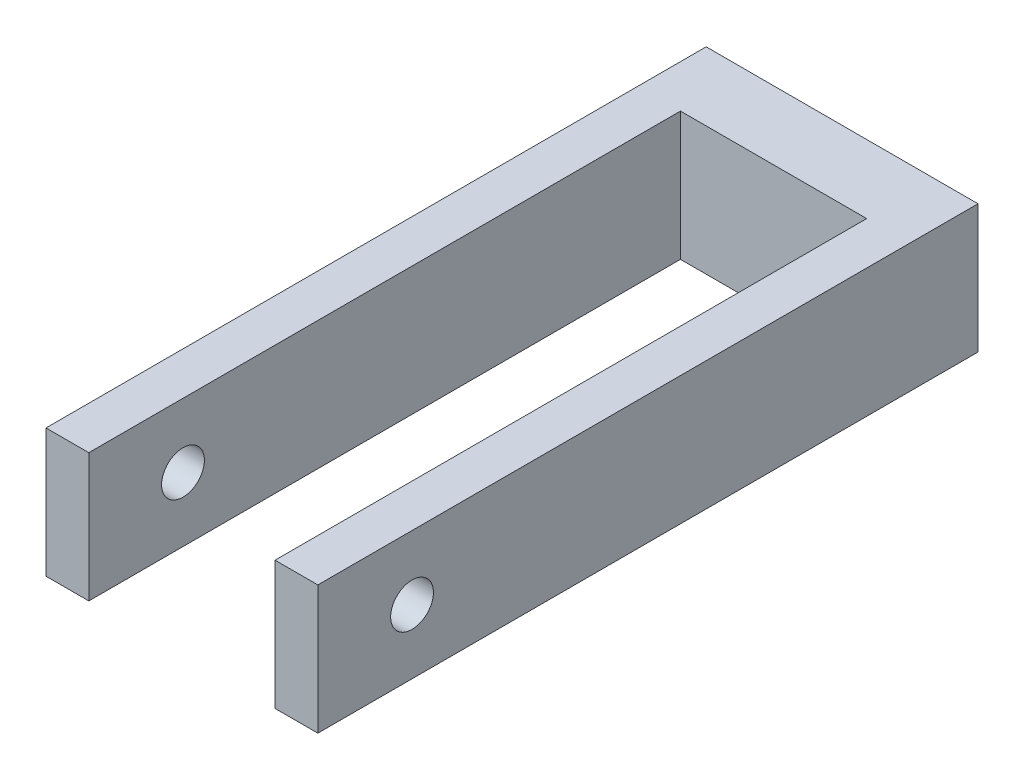
ISO-10303-21;
HEADER;
FILE_DESCRIPTION(('STEP AP214'),'2;1');
FILE_NAME('part.step','',(''),(''),'','','');
FILE_SCHEMA(('AUTOMOTIVE_DESIGN { 1 0 10303 214 1 1 1 1 }'));
ENDSEC;
DATA;
#1=APPLICATION_CONTEXT('core data for automotive mechanical design processes');
#2=APPLICATION_PROTOCOL_DEFINITION('international standard','automotive_design',2000,#1);
#3=PRODUCT_CONTEXT('',#1,'mechanical');
#4=PRODUCT('Part','Part','',(#3));
#5=PRODUCT_RELATED_PRODUCT_CATEGORY('part','',(#4));
#6=PRODUCT_DEFINITION_FORMATION('','',#4);
#7=PRODUCT_DEFINITION_CONTEXT('part definition',#1,'design');
#8=PRODUCT_DEFINITION('design','',#6,#7);
#9=PRODUCT_DEFINITION_SHAPE('','',#8);
#10=(LENGTH_UNIT() NAMED_UNIT(*) SI_UNIT(.MILLI.,.METRE.));
#11=(NAMED_UNIT(*) PLANE_ANGLE_UNIT() SI_UNIT($,.RADIAN.));
#12=(NAMED_UNIT(*) SI_UNIT($,.STERADIAN.) SOLID_ANGLE_UNIT());
#13=UNCERTAINTY_MEASURE_WITH_UNIT(LENGTH_MEASURE(1.E-05),#10,'distance_accuracy_value','');
#14=(GEOMETRIC_REPRESENTATION_CONTEXT(3) GLOBAL_UNCERTAINTY_ASSIGNED_CONTEXT((#13)) GLOBAL_UNIT_ASSIGNED_CONTEXT((#10,
#11,#12)) REPRESENTATION_CONTEXT('',''));
#15=CARTESIAN_POINT('',(0.,0.,0.));
#16=DIRECTION('',(0.,0.,1.));
#17=DIRECTION('',(1.,0.,0.));
#18=AXIS2_PLACEMENT_3D('',#15,#16,#17);
#19=CARTESIAN_POINT('',(0.,0.,8.));
#20=DIRECTION('',(0.,0.,-1.));
#21=DIRECTION('',(-1.,0.,0.));
#22=AXIS2_PLACEMENT_3D('',#19,#20,#21);
#23=PLANE('',#22);
#24=DIRECTION('',(0.,-1.,0.));
#25=VECTOR('',#24,1.);
#26=CARTESIAN_POINT('',(9.94864788732204,8.16903118461885,8.));
#27=LINE('',#26,#25);
#28=CARTESIAN_POINT('',(9.94864788732204,8.16903118461885,8.));
#29=VERTEX_POINT('',#28);
#30=CARTESIAN_POINT('',(9.94864788732204,-6.83096881538115,8.));
#31=VERTEX_POINT('',#30);
#32=EDGE_CURVE('E123',#29,#31,#27,.T.);
#33=ORIENTED_EDGE('',*,*,#32,.F.);
#34=DIRECTION('',(-1.,0.,0.));
#35=VECTOR('',#34,1.);
#36=CARTESIAN_POINT('',(-16.801352112678,8.16903118461885,8.));
#37=LINE('',#36,#35);
#38=CARTESIAN_POINT('',(-11.801352112678,8.16903118461885,8.));
#39=VERTEX_POINT('',#38);
#40=EDGE_CURVE('E155',#29,#39,#37,.T.);
#41=ORIENTED_EDGE('',*,*,#40,.T.);
#42=DIRECTION('',(0.,1.,0.));
#43=VECTOR('',#42,1.);
#44=CARTESIAN_POINT('',(-11.801352112678,8.16903118461885,8.));
#45=LINE('',#44,#43);
#46=CARTESIAN_POINT('',(-11.801352112678,-6.83096881538115,8.));
#47=VERTEX_POINT('',#46);
#48=EDGE_CURVE('E54',#47,#39,#45,.T.);
#49=ORIENTED_EDGE('',*,*,#48,.F.);
#50=DIRECTION('',(1.,0.,0.));
#51=VECTOR('',#50,1.);
#52=CARTESIAN_POINT('',(14.948647887322,-6.83096881538115,8.));
#53=LINE('',#52,#51);
#54=EDGE_CURVE('E49',#47,#31,#53,.T.);
#55=ORIENTED_EDGE('',*,*,#54,.T.);
#56=EDGE_LOOP('',(#33,#41,#49,#55));
#57=FACE_BOUND('',#56,.T.);
#58=ADVANCED_FACE('F33',(#57),#23,.F.);
#59=CARTESIAN_POINT('',(-16.801352112678,-6.83096881538115,8.));
#60=DIRECTION('',(1.,0.,0.));
#61=DIRECTION('',(0.,1.,0.));
#62=AXIS2_PLACEMENT_3D('',#59,#60,#61);
#63=PLANE('',#62);
#64=CARTESIAN_POINT('',(-16.801352112678,0.669031184618845,66.1));
#65=DIRECTION('',(1.,0.,0.));
#66=DIRECTION('',(0.,1.,0.));
#67=AXIS2_PLACEMENT_3D('',#64,#65,#66);
#68=CIRCLE('',#67,2.50000000000001);
#69=CARTESIAN_POINT('',(-16.801352112678,3.16903118461885,66.1));
#70=VERTEX_POINT('',#69);
#71=EDGE_CURVE('E125',#70,#70,#68,.T.);
#72=ORIENTED_EDGE('',*,*,#71,.T.);
#73=EDGE_LOOP('',(#72));
#74=FACE_BOUND('',#73,.T.);
#75=DIRECTION('',(0.,-1.,0.));
#76=VECTOR('',#75,1.);
#77=CARTESIAN_POINT('',(-16.801352112678,-6.83096881538115,0.));
#78=LINE('',#77,#76);
#79=CARTESIAN_POINT('',(-16.801352112678,8.16903118461885,0.));
#80=VERTEX_POINT('',#79);
#81=CARTESIAN_POINT('',(-16.801352112678,-6.83096881538115,0.));
#82=VERTEX_POINT('',#81);
#83=EDGE_CURVE('E153',#80,#82,#78,.T.);
#84=ORIENTED_EDGE('',*,*,#83,.T.);
#85=DIRECTION('',(0.,0.,-1.));
#86=VECTOR('',#85,1.);
#87=CARTESIAN_POINT('',(-16.801352112678,-6.83096881538115,8.));
#88=LINE('',#87,#86);
#89=CARTESIAN_POINT('',(-16.801352112678,-6.83096881538115,77.1));
#90=VERTEX_POINT('',#89);
#91=EDGE_CURVE('E11',#90,#82,#88,.T.);
#92=ORIENTED_EDGE('',*,*,#91,.F.);
#93=DIRECTION('',(0.,-1.,0.));
#94=VECTOR('',#93,1.);
#95=CARTESIAN_POINT('',(-16.801352112678,-6.83096881538115,77.1));
#96=LINE('',#95,#94);
#97=CARTESIAN_POINT('',(-16.801352112678,8.16903118461885,77.1));
#98=VERTEX_POINT('',#97);
#99=EDGE_CURVE('E136',#98,#90,#96,.T.);
#100=ORIENTED_EDGE('',*,*,#99,.F.);
#101=DIRECTION('',(0.,0.,-1.));
#102=VECTOR('',#101,1.);
#103=CARTESIAN_POINT('',(-16.801352112678,8.16903118461885,8.));
#104=LINE('',#103,#102);
#105=EDGE_CURVE('E108',#98,#80,#104,.T.);
#106=ORIENTED_EDGE('',*,*,#105,.T.);
#107=EDGE_LOOP('',(#84,#92,#100,#106));
#108=FACE_BOUND('',#107,.T.);
#109=ADVANCED_FACE('F35',(#74,#108),#63,.F.);
#110=CARTESIAN_POINT('',(14.948647887322,-6.83096881538115,8.));
#111=DIRECTION('',(0.,1.,0.));
#112=DIRECTION('',(-1.,0.,0.));
#113=AXIS2_PLACEMENT_3D('',#110,#111,#112);
#114=PLANE('',#113);
#115=CARTESIAN_POINT('',(-0.926352112677958,-6.83096881538115,4.));
#116=DIRECTION('',(0.,-1.,0.));
#117=DIRECTION('',(1.,0.,0.));
#118=AXIS2_PLACEMENT_3D('',#115,#116,#117);
#119=CIRCLE('',#118,1.5);
#120=CARTESIAN_POINT('',(0.573647887322042,-6.83096881538115,4.));
#121=VERTEX_POINT('',#120);
#122=EDGE_CURVE('E208',#121,#121,#119,.T.);
#123=ORIENTED_EDGE('',*,*,#122,.F.);
#124=EDGE_LOOP('',(#123));
#125=FACE_BOUND('',#124,.T.);
#126=DIRECTION('',(1.,0.,0.));
#127=VECTOR('',#126,1.);
#128=CARTESIAN_POINT('',(14.948647887322,-6.83096881538115,0.));
#129=LINE('',#128,#127);
#130=CARTESIAN_POINT('',(14.948647887322,-6.83096881538115,0.));
#131=VERTEX_POINT('',#130);
#132=EDGE_CURVE('E160',#82,#131,#129,.T.);
#133=ORIENTED_EDGE('',*,*,#132,.T.);
#134=DIRECTION('',(0.,0.,-1.));
#135=VECTOR('',#134,1.);
#136=CARTESIAN_POINT('',(14.948647887322,-6.83096881538115,8.));
#137=LINE('',#136,#135);
#138=CARTESIAN_POINT('',(14.948647887322,-6.83096881538115,77.1));
#139=VERTEX_POINT('',#138);
#140=EDGE_CURVE('E42',#139,#131,#137,.T.);
#141=ORIENTED_EDGE('',*,*,#140,.F.);
#142=DIRECTION('',(1.,0.,0.));
#143=VECTOR('',#142,1.);
#144=CARTESIAN_POINT('',(9.94864788732204,-6.83096881538115,77.1));
#145=LINE('',#144,#143);
#146=CARTESIAN_POINT('',(9.94864788732204,-6.83096881538115,77.1));
#147=VERTEX_POINT('',#146);
#148=EDGE_CURVE('E122',#147,#139,#145,.T.);
#149=ORIENTED_EDGE('',*,*,#148,.F.);
#150=DIRECTION('',(0.,0.,-1.));
#151=VECTOR('',#150,1.);
#152=CARTESIAN_POINT('',(9.94864788732204,-6.83096881538115,77.1));
#153=LINE('',#152,#151);
#154=EDGE_CURVE('E131',#147,#31,#153,.T.);
#155=ORIENTED_EDGE('',*,*,#154,.T.);
#156=ORIENTED_EDGE('',*,*,#54,.F.);
#157=DIRECTION('',(0.,0.,-1.));
#158=VECTOR('',#157,1.);
#159=CARTESIAN_POINT('',(-11.801352112678,-6.83096881538115,77.1));
#160=LINE('',#159,#158);
#161=CARTESIAN_POINT('',(-11.801352112678,-6.83096881538115,77.1));
#162=VERTEX_POINT('',#161);
#163=EDGE_CURVE('E150',#162,#47,#160,.T.);
#164=ORIENTED_EDGE('',*,*,#163,.F.);
#165=DIRECTION('',(1.,0.,0.));
#166=VECTOR('',#165,1.);
#167=CARTESIAN_POINT('',(-11.801352112678,-6.83096881538115,77.1));
#168=LINE('',#167,#166);
#169=EDGE_CURVE('E139',#90,#162,#168,.T.);
#170=ORIENTED_EDGE('',*,*,#169,.F.);
#171=ORIENTED_EDGE('',*,*,#91,.T.);
#172=EDGE_LOOP('',(#133,#141,#149,#155,#156,#164,#170,#171));
#173=FACE_BOUND('',#172,.T.);
#174=ADVANCED_FACE('F181',(#125,#173),#114,.F.);
#175=CARTESIAN_POINT('',(14.948647887322,8.16903118461885,8.));
#176=DIRECTION('',(-1.,0.,0.));
#177=DIRECTION('',(0.,-1.,0.));
#178=AXIS2_PLACEMENT_3D('',#175,#176,#177);
#179=PLANE('',#178);
#180=CARTESIAN_POINT('',(14.948647887322,0.669031184618852,66.1));
#181=DIRECTION('',(1.,0.,0.));
#182=DIRECTION('',(0.,1.,0.));
#183=AXIS2_PLACEMENT_3D('',#180,#181,#182);
#184=CIRCLE('',#183,2.50000000000001);
#185=CARTESIAN_POINT('',(14.948647887322,3.16903118461886,66.1));
#186=VERTEX_POINT('',#185);
#187=EDGE_CURVE('E225',#186,#186,#184,.T.);
#188=ORIENTED_EDGE('',*,*,#187,.F.);
#189=EDGE_LOOP('',(#188));
#190=FACE_BOUND('',#189,.T.);
#191=DIRECTION('',(0.,1.,0.));
#192=VECTOR('',#191,1.);
#193=CARTESIAN_POINT('',(14.948647887322,8.16903118461885,0.));
#194=LINE('',#193,#192);
#195=CARTESIAN_POINT('',(14.948647887322,8.16903118461885,0.));
#196=VERTEX_POINT('',#195);
#197=EDGE_CURVE('E105',#131,#196,#194,.T.);
#198=ORIENTED_EDGE('',*,*,#197,.T.);
#199=DIRECTION('',(0.,0.,-1.));
#200=VECTOR('',#199,1.);
#201=CARTESIAN_POINT('',(14.948647887322,8.16903118461885,8.));
#202=LINE('',#201,#200);
#203=CARTESIAN_POINT('',(14.948647887322,8.16903118461885,77.1));
#204=VERTEX_POINT('',#203);
#205=EDGE_CURVE('E98',#204,#196,#202,.T.);
#206=ORIENTED_EDGE('',*,*,#205,.F.);
#207=DIRECTION('',(0.,1.,0.));
#208=VECTOR('',#207,1.);
#209=CARTESIAN_POINT('',(14.948647887322,-6.83096881538115,77.1));
#210=LINE('',#209,#208);
#211=EDGE_CURVE('E103',#139,#204,#210,.T.);
#212=ORIENTED_EDGE('',*,*,#211,.F.);
#213=ORIENTED_EDGE('',*,*,#140,.T.);
#214=EDGE_LOOP('',(#198,#206,#212,#213));
#215=FACE_BOUND('',#214,.T.);
#216=ADVANCED_FACE('F100',(#190,#215),#179,.F.);
#217=CARTESIAN_POINT('',(-16.801352112678,8.16903118461885,8.));
#218=DIRECTION('',(0.,-1.,0.));
#219=DIRECTION('',(0.,0.,-1.));
#220=AXIS2_PLACEMENT_3D('',#217,#218,#219);
#221=PLANE('',#220);
#222=DIRECTION('',(-1.,0.,0.));
#223=VECTOR('',#222,1.);
#224=CARTESIAN_POINT('',(-16.801352112678,8.16903118461885,0.));
#225=LINE('',#224,#223);
#226=EDGE_CURVE('E156',#196,#80,#225,.T.);
#227=ORIENTED_EDGE('',*,*,#226,.T.);
#228=ORIENTED_EDGE('',*,*,#105,.F.);
#229=DIRECTION('',(-1.,0.,0.));
#230=VECTOR('',#229,1.);
#231=CARTESIAN_POINT('',(-16.801352112678,8.16903118461885,77.1));
#232=LINE('',#231,#230);
#233=CARTESIAN_POINT('',(-11.801352112678,8.16903118461885,77.1));
#234=VERTEX_POINT('',#233);
#235=EDGE_CURVE('E143',#234,#98,#232,.T.);
#236=ORIENTED_EDGE('',*,*,#235,.F.);
#237=DIRECTION('',(0.,0.,-1.));
#238=VECTOR('',#237,1.);
#239=CARTESIAN_POINT('',(-11.801352112678,8.16903118461885,77.1));
#240=LINE('',#239,#238);
#241=EDGE_CURVE('E146',#234,#39,#240,.T.);
#242=ORIENTED_EDGE('',*,*,#241,.T.);
#243=ORIENTED_EDGE('',*,*,#40,.F.);
#244=DIRECTION('',(0.,0.,-1.));
#245=VECTOR('',#244,1.);
#246=CARTESIAN_POINT('',(9.94864788732204,8.16903118461885,77.1));
#247=LINE('',#246,#245);
#248=CARTESIAN_POINT('',(9.94864788732204,8.16903118461885,77.1));
#249=VERTEX_POINT('',#248);
#250=EDGE_CURVE('E114',#249,#29,#247,.T.);
#251=ORIENTED_EDGE('',*,*,#250,.F.);
#252=DIRECTION('',(-1.,0.,0.));
#253=VECTOR('',#252,1.);
#254=CARTESIAN_POINT('',(14.948647887322,8.16903118461885,77.1));
#255=LINE('',#254,#253);
#256=EDGE_CURVE('E111',#204,#249,#255,.T.);
#257=ORIENTED_EDGE('',*,*,#256,.F.);
#258=ORIENTED_EDGE('',*,*,#205,.T.);
#259=EDGE_LOOP('',(#227,#228,#236,#242,#243,#251,#257,#258));
#260=FACE_BOUND('',#259,.T.);
#261=ADVANCED_FACE('F112',(#260),#221,.F.);
#262=CARTESIAN_POINT('',(0.,0.,0.));
#263=DIRECTION('',(0.,0.,-1.));
#264=DIRECTION('',(-1.,0.,0.));
#265=AXIS2_PLACEMENT_3D('',#262,#263,#264);
#266=PLANE('',#265);
#267=CARTESIAN_POINT('',(-0.926352112677959,0.66903118461885,0.));
#268=DIRECTION('',(0.,0.,-1.));
#269=DIRECTION('',(-1.,0.,0.));
#270=AXIS2_PLACEMENT_3D('',#267,#268,#269);
#271=CIRCLE('',#270,4.);
#272=CARTESIAN_POINT('',(-4.92635211267796,0.66903118461885,0.));
#273=VERTEX_POINT('',#272);
#274=EDGE_CURVE('E219',#273,#273,#271,.T.);
#275=ORIENTED_EDGE('',*,*,#274,.F.);
#276=EDGE_LOOP('',(#275));
#277=FACE_BOUND('',#276,.T.);
#278=ORIENTED_EDGE('',*,*,#83,.F.);
#279=ORIENTED_EDGE('',*,*,#226,.F.);
#280=ORIENTED_EDGE('',*,*,#197,.F.);
#281=ORIENTED_EDGE('',*,*,#132,.F.);
#282=EDGE_LOOP('',(#278,#279,#280,#281));
#283=FACE_BOUND('',#282,.T.);
#284=ADVANCED_FACE('F169',(#277,#283),#266,.T.);
#285=CARTESIAN_POINT('',(-11.801352112678,8.16903118461885,77.1));
#286=DIRECTION('',(-1.,0.,0.));
#287=DIRECTION('',(0.,-1.,0.));
#288=AXIS2_PLACEMENT_3D('',#285,#286,#287);
#289=PLANE('',#288);
#290=CARTESIAN_POINT('',(-11.801352112678,0.669031184618846,66.1));
#291=DIRECTION('',(-1.,0.,0.));
#292=DIRECTION('',(0.,-1.,0.));
#293=AXIS2_PLACEMENT_3D('',#290,#291,#292);
#294=CIRCLE('',#293,2.50000000000001);
#295=CARTESIAN_POINT('',(-11.801352112678,-1.83096881538116,66.1));
#296=VERTEX_POINT('',#295);
#297=EDGE_CURVE('E229',#296,#296,#294,.T.);
#298=ORIENTED_EDGE('',*,*,#297,.T.);
#299=EDGE_LOOP('',(#298));
#300=FACE_BOUND('',#299,.T.);
#301=ORIENTED_EDGE('',*,*,#48,.T.);
#302=ORIENTED_EDGE('',*,*,#241,.F.);
#303=DIRECTION('',(0.,1.,0.));
#304=VECTOR('',#303,1.);
#305=CARTESIAN_POINT('',(-11.801352112678,8.16903118461885,77.1));
#306=LINE('',#305,#304);
#307=EDGE_CURVE('E141',#162,#234,#306,.T.);
#308=ORIENTED_EDGE('',*,*,#307,.F.);
#309=ORIENTED_EDGE('',*,*,#163,.T.);
#310=EDGE_LOOP('',(#301,#302,#308,#309));
#311=FACE_BOUND('',#310,.T.);
#312=ADVANCED_FACE('F180',(#300,#311),#289,.F.);
#313=CARTESIAN_POINT('',(0.,0.,77.1));
#314=DIRECTION('',(0.,0.,-1.));
#315=DIRECTION('',(-1.,0.,0.));
#316=AXIS2_PLACEMENT_3D('',#313,#314,#315);
#317=PLANE('',#316);
#318=ORIENTED_EDGE('',*,*,#99,.T.);
#319=ORIENTED_EDGE('',*,*,#169,.T.);
#320=ORIENTED_EDGE('',*,*,#307,.T.);
#321=ORIENTED_EDGE('',*,*,#235,.T.);
#322=EDGE_LOOP('',(#318,#319,#320,#321));
#323=FACE_BOUND('',#322,.T.);
#324=ADVANCED_FACE('F175',(#323),#317,.F.);
#325=CARTESIAN_POINT('',(9.94864788732204,8.16903118461885,77.1));
#326=DIRECTION('',(1.,0.,0.));
#327=DIRECTION('',(0.,1.,0.));
#328=AXIS2_PLACEMENT_3D('',#325,#326,#327);
#329=PLANE('',#328);
#330=CARTESIAN_POINT('',(9.94864788732204,0.669031184618851,66.1));
#331=DIRECTION('',(1.,0.,0.));
#332=DIRECTION('',(0.,1.,0.));
#333=AXIS2_PLACEMENT_3D('',#330,#331,#332);
#334=CIRCLE('',#333,2.50000000000001);
#335=CARTESIAN_POINT('',(9.94864788732204,3.16903118461886,66.1));
#336=VERTEX_POINT('',#335);
#337=EDGE_CURVE('E37',#336,#336,#334,.T.);
#338=ORIENTED_EDGE('',*,*,#337,.T.);
#339=EDGE_LOOP('',(#338));
#340=FACE_BOUND('',#339,.T.);
#341=ORIENTED_EDGE('',*,*,#32,.T.);
#342=ORIENTED_EDGE('',*,*,#154,.F.);
#343=DIRECTION('',(0.,-1.,0.));
#344=VECTOR('',#343,1.);
#345=CARTESIAN_POINT('',(9.94864788732204,8.16903118461885,77.1));
#346=LINE('',#345,#344);
#347=EDGE_CURVE('E117',#249,#147,#346,.T.);
#348=ORIENTED_EDGE('',*,*,#347,.F.);
#349=ORIENTED_EDGE('',*,*,#250,.T.);
#350=EDGE_LOOP('',(#341,#342,#348,#349));
#351=FACE_BOUND('',#350,.T.);
#352=ADVANCED_FACE('F184',(#340,#351),#329,.F.);
#353=CARTESIAN_POINT('',(0.,0.,77.1));
#354=DIRECTION('',(0.,0.,1.));
#355=DIRECTION('',(1.,0.,0.));
#356=AXIS2_PLACEMENT_3D('',#353,#354,#355);
#357=PLANE('',#356);
#358=ORIENTED_EDGE('',*,*,#211,.T.);
#359=ORIENTED_EDGE('',*,*,#256,.T.);
#360=ORIENTED_EDGE('',*,*,#347,.T.);
#361=ORIENTED_EDGE('',*,*,#148,.T.);
#362=EDGE_LOOP('',(#358,#359,#360,#361));
#363=FACE_BOUND('',#362,.T.);
#364=ADVANCED_FACE('F120',(#363),#357,.T.);
#365=CARTESIAN_POINT('',(-54.1513521126779,0.669031184618836,66.1));
#366=DIRECTION('',(1.,0.,0.));
#367=DIRECTION('',(0.,1.,0.));
#368=AXIS2_PLACEMENT_3D('',#365,#366,#367);
#369=CYLINDRICAL_SURFACE('',#368,2.50000000000001);
#370=ORIENTED_EDGE('',*,*,#187,.T.);
#371=EDGE_LOOP('',(#370));
#372=FACE_BOUND('',#371,.T.);
#373=ORIENTED_EDGE('',*,*,#337,.F.);
#374=EDGE_LOOP('',(#373));
#375=FACE_BOUND('',#374,.T.);
#376=ADVANCED_FACE('F238',(#372,#375),#369,.F.);
#377=ORIENTED_EDGE('',*,*,#297,.F.);
#378=EDGE_LOOP('',(#377));
#379=FACE_BOUND('',#378,.T.);
#380=ORIENTED_EDGE('',*,*,#71,.F.);
#381=EDGE_LOOP('',(#380));
#382=FACE_BOUND('',#381,.T.);
#383=ADVANCED_FACE('F240',(#379,#382),#369,.F.);
#384=CARTESIAN_POINT('',(-0.926352112677959,0.66903118461885,4.));
#385=DIRECTION('',(0.,0.,-1.));
#386=DIRECTION('',(-1.,0.,0.));
#387=AXIS2_PLACEMENT_3D('',#384,#385,#386);
#388=CYLINDRICAL_SURFACE('',#387,4.);
#389=CARTESIAN_POINT('',(-0.926352112677959,0.66903118461885,4.));
#390=DIRECTION('',(0.,0.,-1.));
#391=DIRECTION('',(-1.,0.,0.));
#392=AXIS2_PLACEMENT_3D('',#389,#390,#391);
#393=CIRCLE('',#392,4.);
#394=CARTESIAN_POINT('',(-4.92635211267796,0.66903118461885,4.));
#395=VERTEX_POINT('',#394);
#396=EDGE_CURVE('E222',#395,#395,#393,.T.);
#397=ORIENTED_EDGE('',*,*,#396,.F.);
#398=EDGE_LOOP('',(#397));
#399=FACE_BOUND('',#398,.T.);
#400=ORIENTED_EDGE('',*,*,#274,.T.);
#401=EDGE_LOOP('',(#400));
#402=FACE_BOUND('',#401,.T.);
#403=ADVANCED_FACE('F247',(#399,#402),#388,.F.);
#404=CARTESIAN_POINT('',(-0.926352112677959,0.66903118461885,4.));
#405=DIRECTION('',(0.,0.,-1.));
#406=DIRECTION('',(-1.,0.,0.));
#407=AXIS2_PLACEMENT_3D('',#404,#405,#406);
#408=PLANE('',#407);
#409=CARTESIAN_POINT('',(-0.926352112677959,0.66903118461885,4.));
#410=DIRECTION('',(0.,0.,-1.));
#411=DIRECTION('',(-1.,0.,0.));
#412=AXIS2_PLACEMENT_3D('',#409,#410,#411);
#413=CIRCLE('',#412,2.);
#414=CARTESIAN_POINT('',(-2.92635211267796,0.66903118461885,4.));
#415=VERTEX_POINT('',#414);
#416=EDGE_CURVE('E216',#415,#415,#413,.T.);
#417=ORIENTED_EDGE('',*,*,#416,.F.);
#418=EDGE_LOOP('',(#417));
#419=FACE_BOUND('',#418,.T.);
#420=ORIENTED_EDGE('',*,*,#396,.T.);
#421=EDGE_LOOP('',(#420));
#422=FACE_BOUND('',#421,.T.);
#423=ADVANCED_FACE('F321',(#419,#422),#408,.T.);
#424=CARTESIAN_POINT('',(-0.926352112677959,0.66903118461885,4.));
#425=DIRECTION('',(0.,0.,-1.));
#426=DIRECTION('',(-1.,0.,0.));
#427=AXIS2_PLACEMENT_3D('',#424,#425,#426);
#428=CYLINDRICAL_SURFACE('',#427,2.);
#429=ORIENTED_EDGE('',*,*,#416,.T.);
#430=EDGE_LOOP('',(#429));
#431=FACE_BOUND('',#430,.T.);
#432=CARTESIAN_POINT('',(-0.926352112677959,0.66903118461885,0.));
#433=DIRECTION('',(0.,0.,-1.));
#434=DIRECTION('',(-1.,0.,0.));
#435=AXIS2_PLACEMENT_3D('',#432,#433,#434);
#436=CIRCLE('',#435,2.);
#437=CARTESIAN_POINT('',(-2.92635211267796,0.66903118461885,0.));
#438=VERTEX_POINT('',#437);
#439=EDGE_CURVE('E213',#438,#438,#436,.T.);
#440=ORIENTED_EDGE('',*,*,#439,.F.);
#441=EDGE_LOOP('',(#440));
#442=FACE_BOUND('',#441,.T.);
#443=ADVANCED_FACE('F328',(#431,#442),#428,.T.);
#444=ORIENTED_EDGE('',*,*,#439,.T.);
#445=EDGE_LOOP('',(#444));
#446=FACE_BOUND('',#445,.T.);
#447=ADVANCED_FACE('F197',(#446),#266,.T.);
#448=CARTESIAN_POINT('',(-0.926352112677959,-3.83096881538115,4.));
#449=DIRECTION('',(0.,-1.,0.));
#450=DIRECTION('',(1.,0.,0.));
#451=AXIS2_PLACEMENT_3D('',#448,#449,#450);
#452=CYLINDRICAL_SURFACE('',#451,1.5);
#453=CARTESIAN_POINT('',(-0.926352112677959,-3.83096881538115,4.));
#454=DIRECTION('',(0.,-1.,0.));
#455=DIRECTION('',(1.,0.,0.));
#456=AXIS2_PLACEMENT_3D('',#453,#454,#455);
#457=CIRCLE('',#456,1.5);
#458=CARTESIAN_POINT('',(0.573647887322042,-3.83096881538115,4.));
#459=VERTEX_POINT('',#458);
#460=EDGE_CURVE('E210',#459,#459,#457,.T.);
#461=ORIENTED_EDGE('',*,*,#460,.F.);
#462=EDGE_LOOP('',(#461));
#463=FACE_BOUND('',#462,.T.);
#464=ORIENTED_EDGE('',*,*,#122,.T.);
#465=EDGE_LOOP('',(#464));
#466=FACE_BOUND('',#465,.T.);
#467=ADVANCED_FACE('F342',(#463,#466),#452,.F.);
#468=CARTESIAN_POINT('',(-0.926352112677959,-3.83096881538115,4.));
#469=DIRECTION('',(0.,-1.,0.));
#470=DIRECTION('',(1.,0.,0.));
#471=AXIS2_PLACEMENT_3D('',#468,#469,#470);
#472=PLANE('',#471);
#473=ORIENTED_EDGE('',*,*,#460,.T.);
#474=EDGE_LOOP('',(#473));
#475=FACE_BOUND('',#474,.T.);
#476=ADVANCED_FACE('F348',(#475),#472,.T.);
#477=CLOSED_SHELL('',(#58,#109,#174,#216,#261,#284,#312,#324,#352,#364,#376,#383,#403,#423,#443,
#447,#467,#476));
#478=MANIFOLD_SOLID_BREP('B2',#477);
#479=ADVANCED_BREP_SHAPE_REPRESENTATION('',(#18,#478),#14);
#480=SHAPE_DEFINITION_REPRESENTATION(#9,#479);
ENDSEC;
END-ISO-10303-21;
